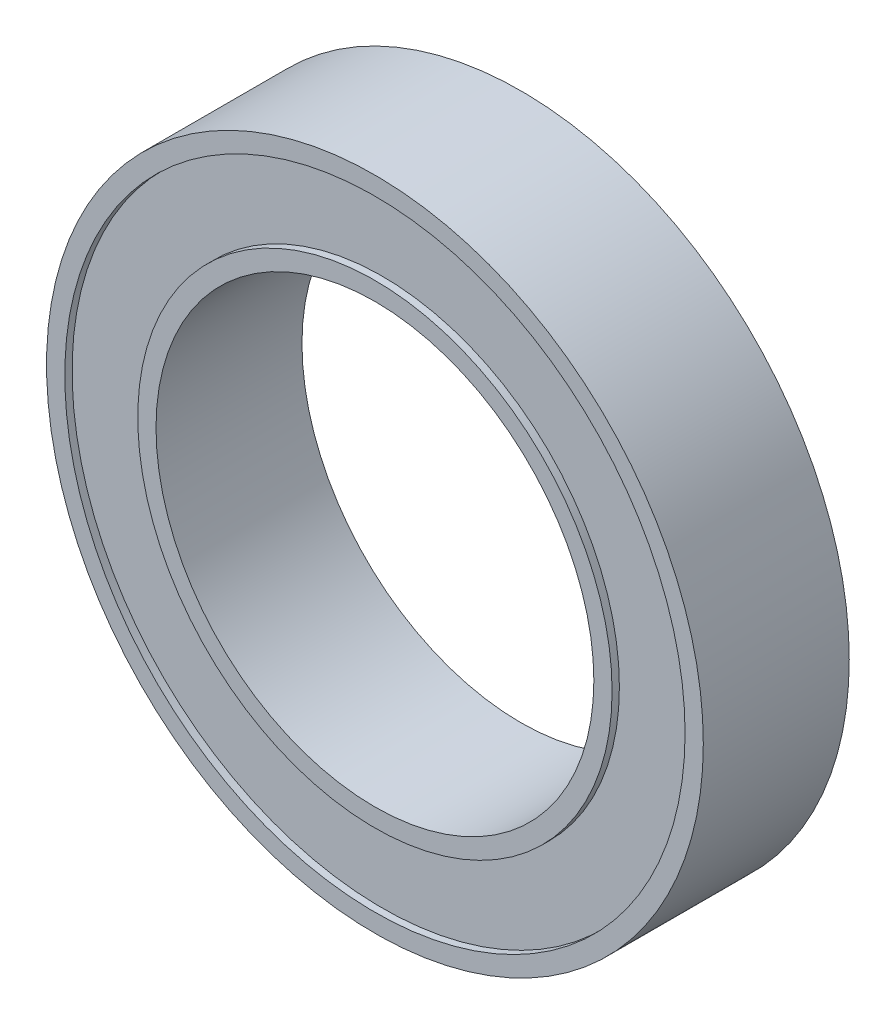
ISO-10303-21;
HEADER;
FILE_DESCRIPTION(('STEP AP214'),'2;1');
FILE_NAME('part.step','',(''),(''),'','','');
FILE_SCHEMA(('AUTOMOTIVE_DESIGN { 1 0 10303 214 1 1 1 1 }'));
ENDSEC;
DATA;
#1=APPLICATION_CONTEXT('core data for automotive mechanical design processes');
#2=APPLICATION_PROTOCOL_DEFINITION('international standard','automotive_design',2000,#1);
#3=PRODUCT_CONTEXT('',#1,'mechanical');
#4=PRODUCT('Part','Part','',(#3));
#5=PRODUCT_RELATED_PRODUCT_CATEGORY('part','',(#4));
#6=PRODUCT_DEFINITION_FORMATION('','',#4);
#7=PRODUCT_DEFINITION_CONTEXT('part definition',#1,'design');
#8=PRODUCT_DEFINITION('design','',#6,#7);
#9=PRODUCT_DEFINITION_SHAPE('','',#8);
#10=(LENGTH_UNIT() NAMED_UNIT(*) SI_UNIT(.MILLI.,.METRE.));
#11=(NAMED_UNIT(*) PLANE_ANGLE_UNIT() SI_UNIT($,.RADIAN.));
#12=(NAMED_UNIT(*) SI_UNIT($,.STERADIAN.) SOLID_ANGLE_UNIT());
#13=UNCERTAINTY_MEASURE_WITH_UNIT(LENGTH_MEASURE(1.E-05),#10,'distance_accuracy_value','');
#14=(GEOMETRIC_REPRESENTATION_CONTEXT(3) GLOBAL_UNCERTAINTY_ASSIGNED_CONTEXT((#13)) GLOBAL_UNIT_ASSIGNED_CONTEXT((#10,
#11,#12)) REPRESENTATION_CONTEXT('',''));
#15=CARTESIAN_POINT('',(0.,0.,0.));
#16=DIRECTION('',(0.,0.,1.));
#17=DIRECTION('',(1.,0.,0.));
#18=AXIS2_PLACEMENT_3D('',#15,#16,#17);
#19=CARTESIAN_POINT('',(0.,0.,4.));
#20=DIRECTION('',(0.,0.,-1.));
#21=DIRECTION('',(-1.,0.,0.));
#22=AXIS2_PLACEMENT_3D('',#19,#20,#21);
#23=CYLINDRICAL_SURFACE('',#22,6.5);
#24=CARTESIAN_POINT('',(0.,0.,0.));
#25=DIRECTION('',(0.,0.,1.));
#26=DIRECTION('',(1.,0.,0.));
#27=AXIS2_PLACEMENT_3D('',#24,#25,#26);
#28=CIRCLE('',#27,6.5);
#29=CARTESIAN_POINT('',(6.5,0.,0.));
#30=VERTEX_POINT('',#29);
#31=EDGE_CURVE('E53',#30,#30,#28,.T.);
#32=ORIENTED_EDGE('',*,*,#31,.T.);
#33=EDGE_LOOP('',(#32));
#34=FACE_BOUND('',#33,.T.);
#35=CARTESIAN_POINT('',(0.,0.,0.2));
#36=DIRECTION('',(0.,0.,1.));
#37=DIRECTION('',(1.,0.,0.));
#38=AXIS2_PLACEMENT_3D('',#35,#36,#37);
#39=CIRCLE('',#38,6.5);
#40=CARTESIAN_POINT('',(6.5,0.,0.2));
#41=VERTEX_POINT('',#40);
#42=EDGE_CURVE('E11',#41,#41,#39,.T.);
#43=ORIENTED_EDGE('',*,*,#42,.F.);
#44=EDGE_LOOP('',(#43));
#45=FACE_BOUND('',#44,.T.);
#46=ADVANCED_FACE('F37',(#34,#45),#23,.T.);
#47=CARTESIAN_POINT('',(0.,0.,4.));
#48=DIRECTION('',(0.,0.,-1.));
#49=DIRECTION('',(-1.,0.,0.));
#50=AXIS2_PLACEMENT_3D('',#47,#48,#49);
#51=CYLINDRICAL_SURFACE('',#50,6.);
#52=CARTESIAN_POINT('',(0.,0.,4.));
#53=DIRECTION('',(0.,0.,1.));
#54=DIRECTION('',(1.,0.,0.));
#55=AXIS2_PLACEMENT_3D('',#52,#53,#54);
#56=CIRCLE('',#55,6.);
#57=CARTESIAN_POINT('',(6.,0.,4.));
#58=VERTEX_POINT('',#57);
#59=EDGE_CURVE('E48',#58,#58,#56,.T.);
#60=ORIENTED_EDGE('',*,*,#59,.T.);
#61=EDGE_LOOP('',(#60));
#62=FACE_BOUND('',#61,.T.);
#63=CARTESIAN_POINT('',(0.,0.,0.));
#64=DIRECTION('',(0.,0.,1.));
#65=DIRECTION('',(1.,0.,0.));
#66=AXIS2_PLACEMENT_3D('',#63,#64,#65);
#67=CIRCLE('',#66,6.);
#68=CARTESIAN_POINT('',(6.,0.,0.));
#69=VERTEX_POINT('',#68);
#70=EDGE_CURVE('E57',#69,#69,#67,.T.);
#71=ORIENTED_EDGE('',*,*,#70,.F.);
#72=EDGE_LOOP('',(#71));
#73=FACE_BOUND('',#72,.T.);
#74=ADVANCED_FACE('F39',(#62,#73),#51,.F.);
#75=CARTESIAN_POINT('',(0.,0.,3.8));
#76=DIRECTION('',(0.,0.,1.));
#77=DIRECTION('',(1.,0.,0.));
#78=AXIS2_PLACEMENT_3D('',#75,#76,#77);
#79=CIRCLE('',#78,6.5);
#80=CARTESIAN_POINT('',(6.5,0.,3.8));
#81=VERTEX_POINT('',#80);
#82=EDGE_CURVE('E59',#81,#81,#79,.T.);
#83=ORIENTED_EDGE('',*,*,#82,.T.);
#84=EDGE_LOOP('',(#83));
#85=FACE_BOUND('',#84,.T.);
#86=CARTESIAN_POINT('',(0.,0.,4.));
#87=DIRECTION('',(0.,0.,1.));
#88=DIRECTION('',(1.,0.,0.));
#89=AXIS2_PLACEMENT_3D('',#86,#87,#88);
#90=CIRCLE('',#89,6.5);
#91=CARTESIAN_POINT('',(6.5,0.,4.));
#92=VERTEX_POINT('',#91);
#93=EDGE_CURVE('E44',#92,#92,#90,.T.);
#94=ORIENTED_EDGE('',*,*,#93,.F.);
#95=EDGE_LOOP('',(#94));
#96=FACE_BOUND('',#95,.T.);
#97=ADVANCED_FACE('F78',(#85,#96),#23,.T.);
#98=CARTESIAN_POINT('',(0.,0.,4.));
#99=DIRECTION('',(0.,0.,1.));
#100=DIRECTION('',(1.,0.,0.));
#101=AXIS2_PLACEMENT_3D('',#98,#99,#100);
#102=PLANE('',#101);
#103=ORIENTED_EDGE('',*,*,#59,.F.);
#104=EDGE_LOOP('',(#103));
#105=FACE_BOUND('',#104,.T.);
#106=ORIENTED_EDGE('',*,*,#93,.T.);
#107=EDGE_LOOP('',(#106));
#108=FACE_BOUND('',#107,.T.);
#109=ADVANCED_FACE('F68',(#105,#108),#102,.T.);
#110=CARTESIAN_POINT('',(0.,0.,0.));
#111=DIRECTION('',(0.,0.,1.));
#112=DIRECTION('',(1.,0.,0.));
#113=AXIS2_PLACEMENT_3D('',#110,#111,#112);
#114=PLANE('',#113);
#115=ORIENTED_EDGE('',*,*,#70,.T.);
#116=EDGE_LOOP('',(#115));
#117=FACE_BOUND('',#116,.T.);
#118=ORIENTED_EDGE('',*,*,#31,.F.);
#119=EDGE_LOOP('',(#118));
#120=FACE_BOUND('',#119,.T.);
#121=ADVANCED_FACE('F65',(#117,#120),#114,.F.);
#122=CARTESIAN_POINT('',(0.,0.,3.8));
#123=DIRECTION('',(0.,0.,1.));
#124=DIRECTION('',(1.,0.,0.));
#125=AXIS2_PLACEMENT_3D('',#122,#123,#124);
#126=PLANE('',#125);
#127=ORIENTED_EDGE('',*,*,#82,.F.);
#128=EDGE_LOOP('',(#127));
#129=FACE_BOUND('',#128,.T.);
#130=CARTESIAN_POINT('',(0.,0.,3.8));
#131=DIRECTION('',(0.,0.,1.));
#132=DIRECTION('',(1.,0.,0.));
#133=AXIS2_PLACEMENT_3D('',#130,#131,#132);
#134=CIRCLE('',#133,8.5);
#135=CARTESIAN_POINT('',(8.5,0.,3.8));
#136=VERTEX_POINT('',#135);
#137=EDGE_CURVE('E96',#136,#136,#134,.F.);
#138=ORIENTED_EDGE('',*,*,#137,.F.);
#139=EDGE_LOOP('',(#138));
#140=FACE_BOUND('',#139,.T.);
#141=ADVANCED_FACE('F67',(#129,#140),#126,.T.);
#142=CARTESIAN_POINT('',(0.,0.,0.2));
#143=DIRECTION('',(0.,0.,1.));
#144=DIRECTION('',(1.,0.,0.));
#145=AXIS2_PLACEMENT_3D('',#142,#143,#144);
#146=PLANE('',#145);
#147=ORIENTED_EDGE('',*,*,#42,.T.);
#148=EDGE_LOOP('',(#147));
#149=FACE_BOUND('',#148,.T.);
#150=CARTESIAN_POINT('',(0.,0.,0.2));
#151=DIRECTION('',(0.,0.,1.));
#152=DIRECTION('',(1.,0.,0.));
#153=AXIS2_PLACEMENT_3D('',#150,#151,#152);
#154=CIRCLE('',#153,8.5);
#155=CARTESIAN_POINT('',(8.5,0.,0.2));
#156=VERTEX_POINT('',#155);
#157=EDGE_CURVE('E93',#156,#156,#154,.T.);
#158=ORIENTED_EDGE('',*,*,#157,.F.);
#159=EDGE_LOOP('',(#158));
#160=FACE_BOUND('',#159,.T.);
#161=ADVANCED_FACE('F75',(#149,#160),#146,.F.);
#162=CARTESIAN_POINT('',(0.,0.,4.));
#163=DIRECTION('',(0.,0.,-1.));
#164=DIRECTION('',(-1.,0.,0.));
#165=AXIS2_PLACEMENT_3D('',#162,#163,#164);
#166=CYLINDRICAL_SURFACE('',#165,8.5);
#167=CARTESIAN_POINT('',(0.,0.,0.));
#168=DIRECTION('',(0.,0.,1.));
#169=DIRECTION('',(1.,0.,0.));
#170=AXIS2_PLACEMENT_3D('',#167,#168,#169);
#171=CIRCLE('',#170,8.5);
#172=CARTESIAN_POINT('',(8.5,0.,0.));
#173=VERTEX_POINT('',#172);
#174=EDGE_CURVE('E105',#173,#173,#171,.T.);
#175=ORIENTED_EDGE('',*,*,#174,.F.);
#176=EDGE_LOOP('',(#175));
#177=FACE_BOUND('',#176,.T.);
#178=ORIENTED_EDGE('',*,*,#157,.T.);
#179=EDGE_LOOP('',(#178));
#180=FACE_BOUND('',#179,.T.);
#181=ADVANCED_FACE('F135',(#177,#180),#166,.F.);
#182=ORIENTED_EDGE('',*,*,#137,.T.);
#183=EDGE_LOOP('',(#182));
#184=FACE_BOUND('',#183,.T.);
#185=CARTESIAN_POINT('',(0.,0.,4.));
#186=DIRECTION('',(0.,0.,1.));
#187=DIRECTION('',(1.,0.,0.));
#188=AXIS2_PLACEMENT_3D('',#185,#186,#187);
#189=CIRCLE('',#188,8.5);
#190=CARTESIAN_POINT('',(8.5,0.,4.));
#191=VERTEX_POINT('',#190);
#192=EDGE_CURVE('E104',#191,#191,#189,.T.);
#193=ORIENTED_EDGE('',*,*,#192,.T.);
#194=EDGE_LOOP('',(#193));
#195=FACE_BOUND('',#194,.T.);
#196=ADVANCED_FACE('F113',(#184,#195),#166,.F.);
#197=CARTESIAN_POINT('',(0.,0.,4.));
#198=DIRECTION('',(0.,0.,-1.));
#199=DIRECTION('',(-1.,0.,0.));
#200=AXIS2_PLACEMENT_3D('',#197,#198,#199);
#201=CYLINDRICAL_SURFACE('',#200,9.);
#202=CARTESIAN_POINT('',(0.,0.,4.));
#203=DIRECTION('',(0.,0.,1.));
#204=DIRECTION('',(1.,0.,0.));
#205=AXIS2_PLACEMENT_3D('',#202,#203,#204);
#206=CIRCLE('',#205,9.);
#207=CARTESIAN_POINT('',(9.,0.,4.));
#208=VERTEX_POINT('',#207);
#209=EDGE_CURVE('E100',#208,#208,#206,.T.);
#210=ORIENTED_EDGE('',*,*,#209,.F.);
#211=EDGE_LOOP('',(#210));
#212=FACE_BOUND('',#211,.T.);
#213=CARTESIAN_POINT('',(0.,0.,0.));
#214=DIRECTION('',(0.,0.,1.));
#215=DIRECTION('',(1.,0.,0.));
#216=AXIS2_PLACEMENT_3D('',#213,#214,#215);
#217=CIRCLE('',#216,9.);
#218=CARTESIAN_POINT('',(9.,0.,0.));
#219=VERTEX_POINT('',#218);
#220=EDGE_CURVE('E101',#219,#219,#217,.T.);
#221=ORIENTED_EDGE('',*,*,#220,.T.);
#222=EDGE_LOOP('',(#221));
#223=FACE_BOUND('',#222,.T.);
#224=ADVANCED_FACE('F119',(#212,#223),#201,.T.);
#225=CARTESIAN_POINT('',(0.,0.,4.));
#226=DIRECTION('',(0.,0.,1.));
#227=DIRECTION('',(1.,0.,0.));
#228=AXIS2_PLACEMENT_3D('',#225,#226,#227);
#229=PLANE('',#228);
#230=ORIENTED_EDGE('',*,*,#192,.F.);
#231=EDGE_LOOP('',(#230));
#232=FACE_BOUND('',#231,.T.);
#233=ORIENTED_EDGE('',*,*,#209,.T.);
#234=EDGE_LOOP('',(#233));
#235=FACE_BOUND('',#234,.T.);
#236=ADVANCED_FACE('F115',(#232,#235),#229,.T.);
#237=CARTESIAN_POINT('',(0.,0.,0.));
#238=DIRECTION('',(0.,0.,1.));
#239=DIRECTION('',(1.,0.,0.));
#240=AXIS2_PLACEMENT_3D('',#237,#238,#239);
#241=PLANE('',#240);
#242=ORIENTED_EDGE('',*,*,#174,.T.);
#243=EDGE_LOOP('',(#242));
#244=FACE_BOUND('',#243,.T.);
#245=ORIENTED_EDGE('',*,*,#220,.F.);
#246=EDGE_LOOP('',(#245));
#247=FACE_BOUND('',#246,.T.);
#248=ADVANCED_FACE('F118',(#244,#247),#241,.F.);
#249=CLOSED_SHELL('',(#46,#74,#97,#109,#121,#141,#161,#181,#196,#224,#236,#248));
#250=MANIFOLD_SOLID_BREP('B2',#249);
#251=ADVANCED_BREP_SHAPE_REPRESENTATION('',(#18,#250),#14);
#252=SHAPE_DEFINITION_REPRESENTATION(#9,#251);
ENDSEC;
END-ISO-10303-21;
